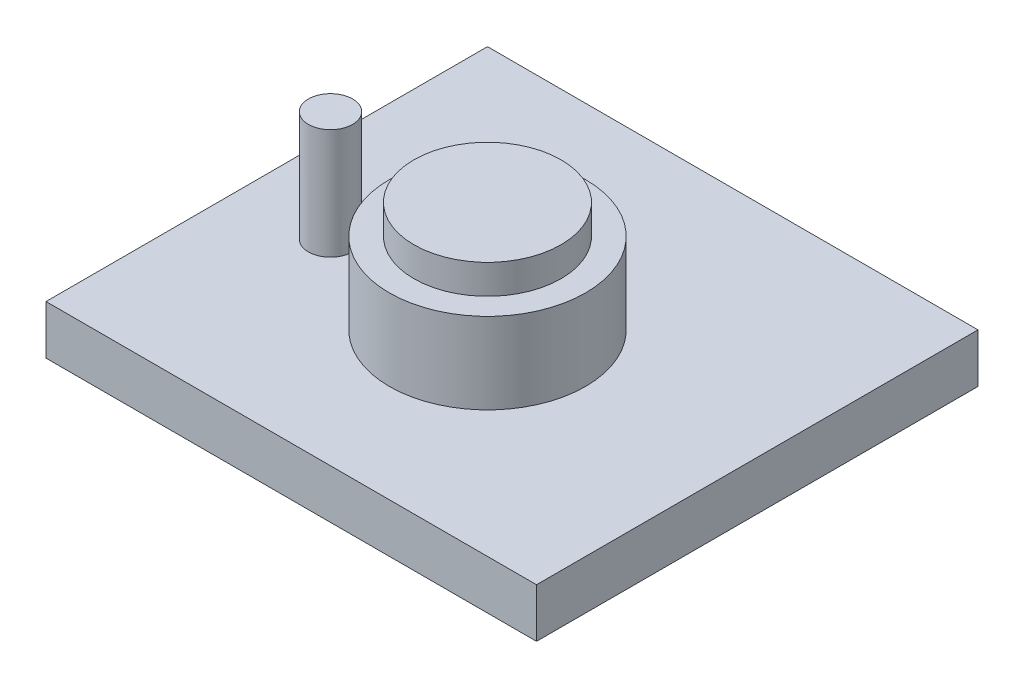
ISO-10303-21;
HEADER;
FILE_DESCRIPTION(('STEP AP214'),'2;1');
FILE_NAME('part.step','',(''),(''),'','','');
FILE_SCHEMA(('AUTOMOTIVE_DESIGN { 1 0 10303 214 1 1 1 1 }'));
ENDSEC;
DATA;
#1=APPLICATION_CONTEXT('core data for automotive mechanical design processes');
#2=APPLICATION_PROTOCOL_DEFINITION('international standard','automotive_design',2000,#1);
#3=PRODUCT_CONTEXT('',#1,'mechanical');
#4=PRODUCT('Part','Part','',(#3));
#5=PRODUCT_RELATED_PRODUCT_CATEGORY('part','',(#4));
#6=PRODUCT_DEFINITION_FORMATION('','',#4);
#7=PRODUCT_DEFINITION_CONTEXT('part definition',#1,'design');
#8=PRODUCT_DEFINITION('design','',#6,#7);
#9=PRODUCT_DEFINITION_SHAPE('','',#8);
#10=(LENGTH_UNIT() NAMED_UNIT(*) SI_UNIT(.MILLI.,.METRE.));
#11=(NAMED_UNIT(*) PLANE_ANGLE_UNIT() SI_UNIT($,.RADIAN.));
#12=(NAMED_UNIT(*) SI_UNIT($,.STERADIAN.) SOLID_ANGLE_UNIT());
#13=UNCERTAINTY_MEASURE_WITH_UNIT(LENGTH_MEASURE(1.E-05),#10,'distance_accuracy_value','');
#14=(GEOMETRIC_REPRESENTATION_CONTEXT(3) GLOBAL_UNCERTAINTY_ASSIGNED_CONTEXT((#13)) GLOBAL_UNIT_ASSIGNED_CONTEXT((#10,
#11,#12)) REPRESENTATION_CONTEXT('',''));
#15=CARTESIAN_POINT('',(0.,0.,0.));
#16=DIRECTION('',(0.,0.,1.));
#17=DIRECTION('',(1.,0.,0.));
#18=AXIS2_PLACEMENT_3D('',#15,#16,#17);
#19=CARTESIAN_POINT('',(0.,11.26,0.));
#20=DIRECTION('',(0.,1.,0.));
#21=DIRECTION('',(-1.,0.,0.));
#22=AXIS2_PLACEMENT_3D('',#19,#20,#21);
#23=CYLINDRICAL_SURFACE('',#22,10.);
#24=CARTESIAN_POINT('',(0.,8.26,0.));
#25=DIRECTION('',(0.,1.,0.));
#26=DIRECTION('',(-1.,0.,0.));
#27=AXIS2_PLACEMENT_3D('',#24,#25,#26);
#28=CIRCLE('',#27,10.);
#29=CARTESIAN_POINT('',(-10.,8.26,0.));
#30=VERTEX_POINT('',#29);
#31=EDGE_CURVE('E48',#30,#30,#28,.T.);
#32=ORIENTED_EDGE('',*,*,#31,.F.);
#33=EDGE_LOOP('',(#32));
#34=FACE_BOUND('',#33,.T.);
#35=CARTESIAN_POINT('',(0.,0.,0.));
#36=DIRECTION('',(0.,1.,0.));
#37=DIRECTION('',(-1.,0.,0.));
#38=AXIS2_PLACEMENT_3D('',#35,#36,#37);
#39=CIRCLE('',#38,10.);
#40=CARTESIAN_POINT('',(-10.,0.,0.));
#41=VERTEX_POINT('',#40);
#42=EDGE_CURVE('E132',#41,#41,#39,.T.);
#43=ORIENTED_EDGE('',*,*,#42,.T.);
#44=EDGE_LOOP('',(#43));
#45=FACE_BOUND('',#44,.T.);
#46=ADVANCED_FACE('F39',(#34,#45),#23,.T.);
#47=CARTESIAN_POINT('',(10.,8.26,0.));
#48=DIRECTION('',(0.,-1.,0.));
#49=DIRECTION('',(1.,0.,0.));
#50=AXIS2_PLACEMENT_3D('',#47,#48,#49);
#51=PLANE('',#50);
#52=CARTESIAN_POINT('',(0.,8.26,0.));
#53=DIRECTION('',(0.,1.,0.));
#54=DIRECTION('',(-1.,0.,0.));
#55=AXIS2_PLACEMENT_3D('',#52,#53,#54);
#56=CIRCLE('',#55,7.5);
#57=CARTESIAN_POINT('',(-7.5,8.26,0.));
#58=VERTEX_POINT('',#57);
#59=EDGE_CURVE('E137',#58,#58,#56,.T.);
#60=ORIENTED_EDGE('',*,*,#59,.F.);
#61=EDGE_LOOP('',(#60));
#62=FACE_BOUND('',#61,.T.);
#63=ORIENTED_EDGE('',*,*,#31,.T.);
#64=EDGE_LOOP('',(#63));
#65=FACE_BOUND('',#64,.T.);
#66=ADVANCED_FACE('F164',(#62,#65),#51,.F.);
#67=CARTESIAN_POINT('',(0.,11.26,0.));
#68=DIRECTION('',(0.,1.,0.));
#69=DIRECTION('',(-1.,0.,0.));
#70=AXIS2_PLACEMENT_3D('',#67,#68,#69);
#71=CYLINDRICAL_SURFACE('',#70,7.5);
#72=CARTESIAN_POINT('',(0.,11.26,0.));
#73=DIRECTION('',(0.,1.,0.));
#74=DIRECTION('',(-1.,0.,0.));
#75=AXIS2_PLACEMENT_3D('',#72,#73,#74);
#76=CIRCLE('',#75,7.5);
#77=CARTESIAN_POINT('',(-7.5,11.26,0.));
#78=VERTEX_POINT('',#77);
#79=EDGE_CURVE('E133',#78,#78,#76,.T.);
#80=ORIENTED_EDGE('',*,*,#79,.F.);
#81=EDGE_LOOP('',(#80));
#82=FACE_BOUND('',#81,.T.);
#83=ORIENTED_EDGE('',*,*,#59,.T.);
#84=EDGE_LOOP('',(#83));
#85=FACE_BOUND('',#84,.T.);
#86=ADVANCED_FACE('F169',(#82,#85),#71,.T.);
#87=CARTESIAN_POINT('',(7.5,11.26,0.));
#88=DIRECTION('',(0.,-1.,0.));
#89=DIRECTION('',(1.,0.,0.));
#90=AXIS2_PLACEMENT_3D('',#87,#88,#89);
#91=PLANE('',#90);
#92=ORIENTED_EDGE('',*,*,#79,.T.);
#93=EDGE_LOOP('',(#92));
#94=FACE_BOUND('',#93,.T.);
#95=ADVANCED_FACE('F176',(#94),#91,.F.);
#96=CARTESIAN_POINT('',(25.,-5.,20.));
#97=DIRECTION('',(-1.,0.,0.));
#98=DIRECTION('',(0.,0.,1.));
#99=AXIS2_PLACEMENT_3D('',#96,#97,#98);
#100=PLANE('',#99);
#101=DIRECTION('',(0.,0.,1.));
#102=VECTOR('',#101,1.);
#103=CARTESIAN_POINT('',(25.,0.,20.));
#104=LINE('',#103,#102);
#105=CARTESIAN_POINT('',(25.,0.,-25.));
#106=VERTEX_POINT('',#105);
#107=CARTESIAN_POINT('',(25.,0.,20.));
#108=VERTEX_POINT('',#107);
#109=EDGE_CURVE('E97',#106,#108,#104,.T.);
#110=ORIENTED_EDGE('',*,*,#109,.T.);
#111=DIRECTION('',(0.,1.,0.));
#112=VECTOR('',#111,1.);
#113=CARTESIAN_POINT('',(25.,-5.,20.));
#114=LINE('',#113,#112);
#115=CARTESIAN_POINT('',(25.,-5.,20.));
#116=VERTEX_POINT('',#115);
#117=EDGE_CURVE('E129',#116,#108,#114,.T.);
#118=ORIENTED_EDGE('',*,*,#117,.F.);
#119=DIRECTION('',(0.,0.,1.));
#120=VECTOR('',#119,1.);
#121=CARTESIAN_POINT('',(25.,-5.,20.));
#122=LINE('',#121,#120);
#123=CARTESIAN_POINT('',(25.,-5.,-25.));
#124=VERTEX_POINT('',#123);
#125=EDGE_CURVE('E91',#124,#116,#122,.T.);
#126=ORIENTED_EDGE('',*,*,#125,.F.);
#127=DIRECTION('',(0.,-1.,0.));
#128=VECTOR('',#127,1.);
#129=CARTESIAN_POINT('',(25.,-5.,-25.));
#130=LINE('',#129,#128);
#131=EDGE_CURVE('E102',#106,#124,#130,.T.);
#132=ORIENTED_EDGE('',*,*,#131,.F.);
#133=EDGE_LOOP('',(#110,#118,#126,#132));
#134=FACE_BOUND('',#133,.T.);
#135=ADVANCED_FACE('F183',(#134),#100,.F.);
#136=CARTESIAN_POINT('',(-25.,-5.,20.));
#137=DIRECTION('',(0.,0.,-1.));
#138=DIRECTION('',(-1.,0.,0.));
#139=AXIS2_PLACEMENT_3D('',#136,#137,#138);
#140=PLANE('',#139);
#141=DIRECTION('',(-1.,0.,0.));
#142=VECTOR('',#141,1.);
#143=CARTESIAN_POINT('',(-25.,0.,20.));
#144=LINE('',#143,#142);
#145=CARTESIAN_POINT('',(-25.,0.,20.));
#146=VERTEX_POINT('',#145);
#147=EDGE_CURVE('E67',#108,#146,#144,.T.);
#148=ORIENTED_EDGE('',*,*,#147,.T.);
#149=DIRECTION('',(0.,1.,0.));
#150=VECTOR('',#149,1.);
#151=CARTESIAN_POINT('',(-25.,-5.,20.));
#152=LINE('',#151,#150);
#153=CARTESIAN_POINT('',(-25.,-5.,20.));
#154=VERTEX_POINT('',#153);
#155=EDGE_CURVE('E89',#154,#146,#152,.T.);
#156=ORIENTED_EDGE('',*,*,#155,.F.);
#157=DIRECTION('',(-1.,0.,0.));
#158=VECTOR('',#157,1.);
#159=CARTESIAN_POINT('',(-25.,-5.,20.));
#160=LINE('',#159,#158);
#161=EDGE_CURVE('E56',#116,#154,#160,.T.);
#162=ORIENTED_EDGE('',*,*,#161,.F.);
#163=ORIENTED_EDGE('',*,*,#117,.T.);
#164=EDGE_LOOP('',(#148,#156,#162,#163));
#165=FACE_BOUND('',#164,.T.);
#166=ADVANCED_FACE('F187',(#165),#140,.F.);
#167=CARTESIAN_POINT('',(-25.,-5.,20.));
#168=DIRECTION('',(1.,0.,0.));
#169=DIRECTION('',(0.,1.,0.));
#170=AXIS2_PLACEMENT_3D('',#167,#168,#169);
#171=PLANE('',#170);
#172=DIRECTION('',(0.,0.,-1.));
#173=VECTOR('',#172,1.);
#174=CARTESIAN_POINT('',(-25.,0.,20.));
#175=LINE('',#174,#173);
#176=CARTESIAN_POINT('',(-25.,0.,-25.));
#177=VERTEX_POINT('',#176);
#178=EDGE_CURVE('E84',#146,#177,#175,.T.);
#179=ORIENTED_EDGE('',*,*,#178,.T.);
#180=DIRECTION('',(0.,1.,0.));
#181=VECTOR('',#180,1.);
#182=CARTESIAN_POINT('',(-25.,-5.,-25.));
#183=LINE('',#182,#181);
#184=CARTESIAN_POINT('',(-25.,-5.,-25.));
#185=VERTEX_POINT('',#184);
#186=EDGE_CURVE('E88',#185,#177,#183,.T.);
#187=ORIENTED_EDGE('',*,*,#186,.F.);
#188=DIRECTION('',(0.,0.,-1.));
#189=VECTOR('',#188,1.);
#190=CARTESIAN_POINT('',(-25.,-5.,20.));
#191=LINE('',#190,#189);
#192=EDGE_CURVE('E72',#154,#185,#191,.T.);
#193=ORIENTED_EDGE('',*,*,#192,.F.);
#194=ORIENTED_EDGE('',*,*,#155,.T.);
#195=EDGE_LOOP('',(#179,#187,#193,#194));
#196=FACE_BOUND('',#195,.T.);
#197=ADVANCED_FACE('F86',(#196),#171,.F.);
#198=CARTESIAN_POINT('',(0.,-5.,0.));
#199=DIRECTION('',(0.,-1.,0.));
#200=DIRECTION('',(1.,0.,0.));
#201=AXIS2_PLACEMENT_3D('',#198,#199,#200);
#202=PLANE('',#201);
#203=ORIENTED_EDGE('',*,*,#125,.T.);
#204=ORIENTED_EDGE('',*,*,#161,.T.);
#205=ORIENTED_EDGE('',*,*,#192,.T.);
#206=DIRECTION('',(-1.,0.,0.));
#207=VECTOR('',#206,1.);
#208=CARTESIAN_POINT('',(-25.,-5.,-25.));
#209=LINE('',#208,#207);
#210=EDGE_CURVE('E105',#124,#185,#209,.T.);
#211=ORIENTED_EDGE('',*,*,#210,.F.);
#212=EDGE_LOOP('',(#203,#204,#205,#211));
#213=FACE_BOUND('',#212,.T.);
#214=ADVANCED_FACE('F150',(#213),#202,.T.);
#215=CARTESIAN_POINT('',(0.,0.,0.));
#216=DIRECTION('',(0.,-1.,0.));
#217=DIRECTION('',(1.,0.,0.));
#218=AXIS2_PLACEMENT_3D('',#215,#216,#217);
#219=PLANE('',#218);
#220=CARTESIAN_POINT('',(-16.,0.,0.));
#221=DIRECTION('',(0.,-1.,0.));
#222=DIRECTION('',(1.,0.,0.));
#223=AXIS2_PLACEMENT_3D('',#220,#221,#222);
#224=CIRCLE('',#223,2.25);
#225=CARTESIAN_POINT('',(-13.75,0.,0.));
#226=VERTEX_POINT('',#225);
#227=EDGE_CURVE('E11',#226,#226,#224,.F.);
#228=ORIENTED_EDGE('',*,*,#227,.F.);
#229=EDGE_LOOP('',(#228));
#230=FACE_BOUND('',#229,.T.);
#231=ORIENTED_EDGE('',*,*,#42,.F.);
#232=EDGE_LOOP('',(#231));
#233=FACE_BOUND('',#232,.T.);
#234=ORIENTED_EDGE('',*,*,#109,.F.);
#235=DIRECTION('',(1.,0.,0.));
#236=VECTOR('',#235,1.);
#237=CARTESIAN_POINT('',(-25.,0.,-25.));
#238=LINE('',#237,#236);
#239=EDGE_CURVE('E94',#177,#106,#238,.T.);
#240=ORIENTED_EDGE('',*,*,#239,.F.);
#241=ORIENTED_EDGE('',*,*,#178,.F.);
#242=ORIENTED_EDGE('',*,*,#147,.F.);
#243=EDGE_LOOP('',(#234,#240,#241,#242));
#244=FACE_BOUND('',#243,.T.);
#245=ADVANCED_FACE('F95',(#230,#233,#244),#219,.F.);
#246=CARTESIAN_POINT('',(-16.,11.26,0.));
#247=DIRECTION('',(0.,-1.,0.));
#248=DIRECTION('',(1.,0.,0.));
#249=AXIS2_PLACEMENT_3D('',#246,#247,#248);
#250=CYLINDRICAL_SURFACE('',#249,2.25);
#251=CARTESIAN_POINT('',(-16.,11.26,0.));
#252=DIRECTION('',(0.,1.,0.));
#253=DIRECTION('',(-1.,0.,0.));
#254=AXIS2_PLACEMENT_3D('',#251,#252,#253);
#255=CIRCLE('',#254,2.25);
#256=CARTESIAN_POINT('',(-18.25,11.26,0.));
#257=VERTEX_POINT('',#256);
#258=EDGE_CURVE('E113',#257,#257,#255,.T.);
#259=ORIENTED_EDGE('',*,*,#258,.F.);
#260=EDGE_LOOP('',(#259));
#261=FACE_BOUND('',#260,.T.);
#262=ORIENTED_EDGE('',*,*,#227,.T.);
#263=EDGE_LOOP('',(#262));
#264=FACE_BOUND('',#263,.T.);
#265=ADVANCED_FACE('F149',(#261,#264),#250,.T.);
#266=CARTESIAN_POINT('',(-16.,11.26,0.));
#267=DIRECTION('',(0.,1.,0.));
#268=DIRECTION('',(-1.,0.,0.));
#269=AXIS2_PLACEMENT_3D('',#266,#267,#268);
#270=PLANE('',#269);
#271=ORIENTED_EDGE('',*,*,#258,.T.);
#272=EDGE_LOOP('',(#271));
#273=FACE_BOUND('',#272,.T.);
#274=ADVANCED_FACE('F157',(#273),#270,.T.);
#275=CARTESIAN_POINT('',(0.,0.,-25.));
#276=DIRECTION('',(0.,0.,-1.));
#277=DIRECTION('',(-1.,0.,0.));
#278=AXIS2_PLACEMENT_3D('',#275,#276,#277);
#279=PLANE('',#278);
#280=ORIENTED_EDGE('',*,*,#186,.T.);
#281=ORIENTED_EDGE('',*,*,#239,.T.);
#282=ORIENTED_EDGE('',*,*,#131,.T.);
#283=ORIENTED_EDGE('',*,*,#210,.T.);
#284=EDGE_LOOP('',(#280,#281,#282,#283));
#285=FACE_BOUND('',#284,.T.);
#286=ADVANCED_FACE('F104',(#285),#279,.T.);
#287=CLOSED_SHELL('',(#46,#66,#86,#95,#135,#166,#197,#214,#245,#265,#274,#286));
#288=MANIFOLD_SOLID_BREP('B2',#287);
#289=ADVANCED_BREP_SHAPE_REPRESENTATION('',(#18,#288),#14);
#290=SHAPE_DEFINITION_REPRESENTATION(#9,#289);
ENDSEC;
END-ISO-10303-21;
